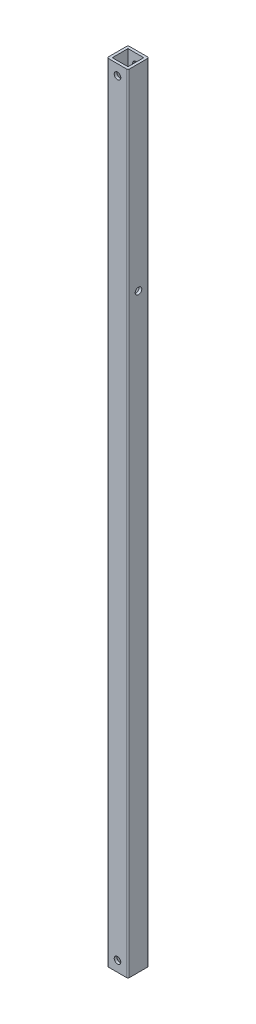
ISO-10303-21;
HEADER;
FILE_DESCRIPTION(('STEP AP214'),'2;1');
FILE_NAME('part.step','',(''),(''),'','','');
FILE_SCHEMA(('AUTOMOTIVE_DESIGN { 1 0 10303 214 1 1 1 1 }'));
ENDSEC;
DATA;
#1=APPLICATION_CONTEXT('core data for automotive mechanical design processes');
#2=APPLICATION_PROTOCOL_DEFINITION('international standard','automotive_design',2000,#1);
#3=PRODUCT_CONTEXT('',#1,'mechanical');
#4=PRODUCT('Part','Part','',(#3));
#5=PRODUCT_RELATED_PRODUCT_CATEGORY('part','',(#4));
#6=PRODUCT_DEFINITION_FORMATION('','',#4);
#7=PRODUCT_DEFINITION_CONTEXT('part definition',#1,'design');
#8=PRODUCT_DEFINITION('design','',#6,#7);
#9=PRODUCT_DEFINITION_SHAPE('','',#8);
#10=(LENGTH_UNIT() NAMED_UNIT(*) SI_UNIT(.MILLI.,.METRE.));
#11=(NAMED_UNIT(*) PLANE_ANGLE_UNIT() SI_UNIT($,.RADIAN.));
#12=(NAMED_UNIT(*) SI_UNIT($,.STERADIAN.) SOLID_ANGLE_UNIT());
#13=UNCERTAINTY_MEASURE_WITH_UNIT(LENGTH_MEASURE(1.E-05),#10,'distance_accuracy_value','');
#14=(GEOMETRIC_REPRESENTATION_CONTEXT(3) GLOBAL_UNCERTAINTY_ASSIGNED_CONTEXT((#13)) GLOBAL_UNIT_ASSIGNED_CONTEXT((#10,
#11,#12)) REPRESENTATION_CONTEXT('',''));
#15=CARTESIAN_POINT('',(0.,0.,0.));
#16=DIRECTION('',(0.,0.,1.));
#17=DIRECTION('',(1.,0.,0.));
#18=AXIS2_PLACEMENT_3D('',#15,#16,#17);
#19=CARTESIAN_POINT('',(0.,600.,0.));
#20=DIRECTION('',(0.,1.,0.));
#21=DIRECTION('',(0.,0.,1.));
#22=AXIS2_PLACEMENT_3D('',#19,#20,#21);
#23=PLANE('',#22);
#24=DIRECTION('',(0.,0.,-1.));
#25=VECTOR('',#24,1.);
#26=CARTESIAN_POINT('',(11.2782874617737,600.,-5.21100917431192));
#27=LINE('',#26,#25);
#28=CARTESIAN_POINT('',(11.2782874617737,600.,9.78899082568807));
#29=VERTEX_POINT('',#28);
#30=CARTESIAN_POINT('',(11.2782874617737,600.,-4.21100917431192));
#31=VERTEX_POINT('',#30);
#32=EDGE_CURVE('E204',#29,#31,#27,.T.);
#33=ORIENTED_EDGE('',*,*,#32,.T.);
#34=CARTESIAN_POINT('',(10.2782874617737,600.,-4.21100917431192));
#35=DIRECTION('',(0.,1.,0.));
#36=DIRECTION('',(0.,0.,1.));
#37=AXIS2_PLACEMENT_3D('',#34,#35,#36);
#38=CIRCLE('',#37,1.);
#39=CARTESIAN_POINT('',(10.2782874617737,600.,-5.21100917431192));
#40=VERTEX_POINT('',#39);
#41=EDGE_CURVE('E259',#31,#40,#38,.T.);
#42=ORIENTED_EDGE('',*,*,#41,.T.);
#43=DIRECTION('',(-1.,0.,0.));
#44=VECTOR('',#43,1.);
#45=CARTESIAN_POINT('',(-4.7217125382263,600.,-5.21100917431192));
#46=LINE('',#45,#44);
#47=CARTESIAN_POINT('',(-3.7217125382263,600.,-5.21100917431192));
#48=VERTEX_POINT('',#47);
#49=EDGE_CURVE('E208',#40,#48,#46,.T.);
#50=ORIENTED_EDGE('',*,*,#49,.T.);
#51=CARTESIAN_POINT('',(-3.7217125382263,600.,-4.21100917431192));
#52=DIRECTION('',(0.,1.,0.));
#53=DIRECTION('',(0.,0.,1.));
#54=AXIS2_PLACEMENT_3D('',#51,#52,#53);
#55=CIRCLE('',#54,1.);
#56=CARTESIAN_POINT('',(-4.7217125382263,600.,-4.21100917431192));
#57=VERTEX_POINT('',#56);
#58=EDGE_CURVE('E256',#48,#57,#55,.T.);
#59=ORIENTED_EDGE('',*,*,#58,.T.);
#60=DIRECTION('',(0.,0.,1.));
#61=VECTOR('',#60,1.);
#62=CARTESIAN_POINT('',(-4.7217125382263,600.,-5.21100917431192));
#63=LINE('',#62,#61);
#64=CARTESIAN_POINT('',(-4.7217125382263,600.,9.78899082568807));
#65=VERTEX_POINT('',#64);
#66=EDGE_CURVE('E197',#57,#65,#63,.T.);
#67=ORIENTED_EDGE('',*,*,#66,.T.);
#68=CARTESIAN_POINT('',(-3.7217125382263,600.,9.78899082568807));
#69=DIRECTION('',(0.,1.,0.));
#70=DIRECTION('',(0.,0.,1.));
#71=AXIS2_PLACEMENT_3D('',#68,#69,#70);
#72=CIRCLE('',#71,1.);
#73=CARTESIAN_POINT('',(-3.7217125382263,600.,10.7889908256881));
#74=VERTEX_POINT('',#73);
#75=EDGE_CURVE('E72',#65,#74,#72,.T.);
#76=ORIENTED_EDGE('',*,*,#75,.T.);
#77=DIRECTION('',(1.,0.,0.));
#78=VECTOR('',#77,1.);
#79=CARTESIAN_POINT('',(-4.7217125382263,600.,10.7889908256881));
#80=LINE('',#79,#78);
#81=CARTESIAN_POINT('',(10.2782874617737,600.,10.7889908256881));
#82=VERTEX_POINT('',#81);
#83=EDGE_CURVE('E200',#74,#82,#80,.T.);
#84=ORIENTED_EDGE('',*,*,#83,.T.);
#85=CARTESIAN_POINT('',(10.2782874617737,600.,9.78899082568807));
#86=DIRECTION('',(0.,1.,0.));
#87=DIRECTION('',(0.,0.,1.));
#88=AXIS2_PLACEMENT_3D('',#85,#86,#87);
#89=CIRCLE('',#88,1.);
#90=EDGE_CURVE('E251',#82,#29,#89,.T.);
#91=ORIENTED_EDGE('',*,*,#90,.T.);
#92=EDGE_LOOP('',(#33,#42,#50,#59,#67,#76,#84,#91));
#93=FACE_BOUND('',#92,.T.);
#94=DIRECTION('',(0.,0.,1.));
#95=VECTOR('',#94,1.);
#96=CARTESIAN_POINT('',(-2.7217125382263,600.,-3.21100917431193));
#97=LINE('',#96,#95);
#98=CARTESIAN_POINT('',(-2.7217125382263,600.,-3.21100917431193));
#99=VERTEX_POINT('',#98);
#100=CARTESIAN_POINT('',(-2.7217125382263,600.,8.78899082568807));
#101=VERTEX_POINT('',#100);
#102=EDGE_CURVE('E153',#99,#101,#97,.T.);
#103=ORIENTED_EDGE('',*,*,#102,.F.);
#104=DIRECTION('',(-1.,0.,0.));
#105=VECTOR('',#104,1.);
#106=CARTESIAN_POINT('',(-2.7217125382263,600.,-3.21100917431193));
#107=LINE('',#106,#105);
#108=CARTESIAN_POINT('',(9.2782874617737,600.,-3.21100917431193));
#109=VERTEX_POINT('',#108);
#110=EDGE_CURVE('E142',#109,#99,#107,.T.);
#111=ORIENTED_EDGE('',*,*,#110,.F.);
#112=DIRECTION('',(0.,0.,-1.));
#113=VECTOR('',#112,1.);
#114=CARTESIAN_POINT('',(9.2782874617737,600.,-3.21100917431193));
#115=LINE('',#114,#113);
#116=CARTESIAN_POINT('',(9.2782874617737,600.,8.78899082568807));
#117=VERTEX_POINT('',#116);
#118=EDGE_CURVE('E171',#117,#109,#115,.T.);
#119=ORIENTED_EDGE('',*,*,#118,.F.);
#120=DIRECTION('',(1.,0.,0.));
#121=VECTOR('',#120,1.);
#122=CARTESIAN_POINT('',(-2.7217125382263,600.,8.78899082568807));
#123=LINE('',#122,#121);
#124=EDGE_CURVE('E167',#101,#117,#123,.T.);
#125=ORIENTED_EDGE('',*,*,#124,.F.);
#126=EDGE_LOOP('',(#103,#111,#119,#125));
#127=FACE_BOUND('',#126,.T.);
#128=ADVANCED_FACE('F48',(#93,#127),#23,.T.);
#129=CARTESIAN_POINT('',(0.,0.,0.));
#130=DIRECTION('',(0.,1.,0.));
#131=DIRECTION('',(0.,0.,1.));
#132=AXIS2_PLACEMENT_3D('',#129,#130,#131);
#133=PLANE('',#132);
#134=DIRECTION('',(-1.,0.,0.));
#135=VECTOR('',#134,1.);
#136=CARTESIAN_POINT('',(-4.7217125382263,0.,-5.21100917431192));
#137=LINE('',#136,#135);
#138=CARTESIAN_POINT('',(10.2782874617737,0.,-5.21100917431192));
#139=VERTEX_POINT('',#138);
#140=CARTESIAN_POINT('',(-3.7217125382263,0.,-5.21100917431192));
#141=VERTEX_POINT('',#140);
#142=EDGE_CURVE('E201',#139,#141,#137,.T.);
#143=ORIENTED_EDGE('',*,*,#142,.F.);
#144=CARTESIAN_POINT('',(10.2782874617737,0.,-4.21100917431192));
#145=DIRECTION('',(0.,1.,0.));
#146=DIRECTION('',(0.,0.,1.));
#147=AXIS2_PLACEMENT_3D('',#144,#145,#146);
#148=CIRCLE('',#147,1.);
#149=CARTESIAN_POINT('',(11.2782874617737,0.,-4.21100917431192));
#150=VERTEX_POINT('',#149);
#151=EDGE_CURVE('E241',#139,#150,#148,.F.);
#152=ORIENTED_EDGE('',*,*,#151,.T.);
#153=DIRECTION('',(0.,0.,-1.));
#154=VECTOR('',#153,1.);
#155=CARTESIAN_POINT('',(11.2782874617737,0.,-5.21100917431192));
#156=LINE('',#155,#154);
#157=CARTESIAN_POINT('',(11.2782874617737,0.,9.78899082568807));
#158=VERTEX_POINT('',#157);
#159=EDGE_CURVE('E219',#158,#150,#156,.T.);
#160=ORIENTED_EDGE('',*,*,#159,.F.);
#161=CARTESIAN_POINT('',(10.2782874617737,0.,9.78899082568807));
#162=DIRECTION('',(0.,1.,0.));
#163=DIRECTION('',(0.,0.,1.));
#164=AXIS2_PLACEMENT_3D('',#161,#162,#163);
#165=CIRCLE('',#164,1.);
#166=CARTESIAN_POINT('',(10.2782874617737,0.,10.7889908256881));
#167=VERTEX_POINT('',#166);
#168=EDGE_CURVE('E232',#158,#167,#165,.F.);
#169=ORIENTED_EDGE('',*,*,#168,.T.);
#170=DIRECTION('',(1.,0.,0.));
#171=VECTOR('',#170,1.);
#172=CARTESIAN_POINT('',(-4.7217125382263,0.,10.7889908256881));
#173=LINE('',#172,#171);
#174=CARTESIAN_POINT('',(-3.7217125382263,0.,10.7889908256881));
#175=VERTEX_POINT('',#174);
#176=EDGE_CURVE('E216',#175,#167,#173,.T.);
#177=ORIENTED_EDGE('',*,*,#176,.F.);
#178=CARTESIAN_POINT('',(-3.7217125382263,0.,9.78899082568807));
#179=DIRECTION('',(0.,1.,0.));
#180=DIRECTION('',(0.,0.,1.));
#181=AXIS2_PLACEMENT_3D('',#178,#179,#180);
#182=CIRCLE('',#181,1.);
#183=CARTESIAN_POINT('',(-4.7217125382263,0.,9.78899082568807));
#184=VERTEX_POINT('',#183);
#185=EDGE_CURVE('E235',#175,#184,#182,.F.);
#186=ORIENTED_EDGE('',*,*,#185,.T.);
#187=DIRECTION('',(0.,0.,1.));
#188=VECTOR('',#187,1.);
#189=CARTESIAN_POINT('',(-4.7217125382263,0.,-5.21100917431192));
#190=LINE('',#189,#188);
#191=CARTESIAN_POINT('',(-4.7217125382263,0.,-4.21100917431192));
#192=VERTEX_POINT('',#191);
#193=EDGE_CURVE('E162',#192,#184,#190,.T.);
#194=ORIENTED_EDGE('',*,*,#193,.F.);
#195=CARTESIAN_POINT('',(-3.7217125382263,0.,-4.21100917431192));
#196=DIRECTION('',(0.,1.,0.));
#197=DIRECTION('',(0.,0.,1.));
#198=AXIS2_PLACEMENT_3D('',#195,#196,#197);
#199=CIRCLE('',#198,1.);
#200=EDGE_CURVE('E238',#192,#141,#199,.F.);
#201=ORIENTED_EDGE('',*,*,#200,.T.);
#202=EDGE_LOOP('',(#143,#152,#160,#169,#177,#186,#194,#201));
#203=FACE_BOUND('',#202,.T.);
#204=DIRECTION('',(-1.,0.,0.));
#205=VECTOR('',#204,1.);
#206=CARTESIAN_POINT('',(-2.7217125382263,0.,-3.21100917431193));
#207=LINE('',#206,#205);
#208=CARTESIAN_POINT('',(9.2782874617737,0.,-3.21100917431193));
#209=VERTEX_POINT('',#208);
#210=CARTESIAN_POINT('',(-2.7217125382263,0.,-3.21100917431193));
#211=VERTEX_POINT('',#210);
#212=EDGE_CURVE('E177',#209,#211,#207,.T.);
#213=ORIENTED_EDGE('',*,*,#212,.T.);
#214=DIRECTION('',(0.,0.,1.));
#215=VECTOR('',#214,1.);
#216=CARTESIAN_POINT('',(-2.7217125382263,0.,-3.21100917431193));
#217=LINE('',#216,#215);
#218=CARTESIAN_POINT('',(-2.7217125382263,0.,8.78899082568807));
#219=VERTEX_POINT('',#218);
#220=EDGE_CURVE('E160',#211,#219,#217,.T.);
#221=ORIENTED_EDGE('',*,*,#220,.T.);
#222=DIRECTION('',(1.,0.,0.));
#223=VECTOR('',#222,1.);
#224=CARTESIAN_POINT('',(-2.7217125382263,0.,8.78899082568807));
#225=LINE('',#224,#223);
#226=CARTESIAN_POINT('',(9.2782874617737,0.,8.78899082568807));
#227=VERTEX_POINT('',#226);
#228=EDGE_CURVE('E183',#219,#227,#225,.T.);
#229=ORIENTED_EDGE('',*,*,#228,.T.);
#230=DIRECTION('',(0.,0.,-1.));
#231=VECTOR('',#230,1.);
#232=CARTESIAN_POINT('',(9.2782874617737,0.,-3.21100917431193));
#233=LINE('',#232,#231);
#234=EDGE_CURVE('E154',#227,#209,#233,.T.);
#235=ORIENTED_EDGE('',*,*,#234,.T.);
#236=EDGE_LOOP('',(#213,#221,#229,#235));
#237=FACE_BOUND('',#236,.T.);
#238=ADVANCED_FACE('F333',(#203,#237),#133,.F.);
#239=CARTESIAN_POINT('',(-4.7217125382263,600.,-5.21100917431192));
#240=DIRECTION('',(1.,0.,0.));
#241=DIRECTION('',(0.,0.,-1.));
#242=AXIS2_PLACEMENT_3D('',#239,#240,#241);
#243=PLANE('',#242);
#244=CARTESIAN_POINT('',(-4.7217125382263,450.,2.78899082568808));
#245=DIRECTION('',(1.,0.,0.));
#246=DIRECTION('',(0.,0.,-1.));
#247=AXIS2_PLACEMENT_3D('',#244,#245,#246);
#248=CIRCLE('',#247,2.5);
#249=CARTESIAN_POINT('',(-4.7217125382263,450.,0.288990825688076));
#250=VERTEX_POINT('',#249);
#251=EDGE_CURVE('E312',#250,#250,#248,.T.);
#252=ORIENTED_EDGE('',*,*,#251,.T.);
#253=EDGE_LOOP('',(#252));
#254=FACE_BOUND('',#253,.T.);
#255=ORIENTED_EDGE('',*,*,#66,.F.);
#256=DIRECTION('',(0.,-1.,0.));
#257=VECTOR('',#256,1.);
#258=CARTESIAN_POINT('',(-4.7217125382263,600.,-4.21100917431192));
#259=LINE('',#258,#257);
#260=EDGE_CURVE('E265',#57,#192,#259,.T.);
#261=ORIENTED_EDGE('',*,*,#260,.T.);
#262=ORIENTED_EDGE('',*,*,#193,.T.);
#263=DIRECTION('',(0.,-1.,0.));
#264=VECTOR('',#263,1.);
#265=CARTESIAN_POINT('',(-4.7217125382263,600.,9.78899082568807));
#266=LINE('',#265,#264);
#267=EDGE_CURVE('E262',#184,#65,#266,.F.);
#268=ORIENTED_EDGE('',*,*,#267,.T.);
#269=EDGE_LOOP('',(#255,#261,#262,#268));
#270=FACE_BOUND('',#269,.T.);
#271=ADVANCED_FACE('F351',(#254,#270),#243,.F.);
#272=CARTESIAN_POINT('',(-4.7217125382263,600.,10.7889908256881));
#273=DIRECTION('',(0.,0.,-1.));
#274=DIRECTION('',(-1.,0.,0.));
#275=AXIS2_PLACEMENT_3D('',#272,#273,#274);
#276=PLANE('',#275);
#277=CARTESIAN_POINT('',(3.2782874617737,592.,10.7889908256881));
#278=DIRECTION('',(0.,0.,1.));
#279=DIRECTION('',(1.,0.,0.));
#280=AXIS2_PLACEMENT_3D('',#277,#278,#279);
#281=CIRCLE('',#280,2.5);
#282=CARTESIAN_POINT('',(5.7782874617737,592.,10.7889908256881));
#283=VERTEX_POINT('',#282);
#284=EDGE_CURVE('E298',#283,#283,#281,.T.);
#285=ORIENTED_EDGE('',*,*,#284,.F.);
#286=EDGE_LOOP('',(#285));
#287=FACE_BOUND('',#286,.T.);
#288=CARTESIAN_POINT('',(3.2782874617737,8.,10.7889908256881));
#289=DIRECTION('',(0.,0.,1.));
#290=DIRECTION('',(1.,0.,0.));
#291=AXIS2_PLACEMENT_3D('',#288,#289,#290);
#292=CIRCLE('',#291,2.5);
#293=CARTESIAN_POINT('',(5.7782874617737,8.,10.7889908256881));
#294=VERTEX_POINT('',#293);
#295=EDGE_CURVE('E293',#294,#294,#292,.T.);
#296=ORIENTED_EDGE('',*,*,#295,.F.);
#297=EDGE_LOOP('',(#296));
#298=FACE_BOUND('',#297,.T.);
#299=ORIENTED_EDGE('',*,*,#83,.F.);
#300=DIRECTION('',(0.,-1.,0.));
#301=VECTOR('',#300,1.);
#302=CARTESIAN_POINT('',(-3.7217125382263,600.,10.7889908256881));
#303=LINE('',#302,#301);
#304=EDGE_CURVE('E11',#74,#175,#303,.T.);
#305=ORIENTED_EDGE('',*,*,#304,.T.);
#306=ORIENTED_EDGE('',*,*,#176,.T.);
#307=DIRECTION('',(0.,-1.,0.));
#308=VECTOR('',#307,1.);
#309=CARTESIAN_POINT('',(10.2782874617737,600.,10.7889908256881));
#310=LINE('',#309,#308);
#311=EDGE_CURVE('E58',#167,#82,#310,.F.);
#312=ORIENTED_EDGE('',*,*,#311,.T.);
#313=EDGE_LOOP('',(#299,#305,#306,#312));
#314=FACE_BOUND('',#313,.T.);
#315=ADVANCED_FACE('F363',(#287,#298,#314),#276,.F.);
#316=CARTESIAN_POINT('',(11.2782874617737,600.,-5.21100917431192));
#317=DIRECTION('',(-1.,0.,0.));
#318=DIRECTION('',(0.,0.,1.));
#319=AXIS2_PLACEMENT_3D('',#316,#317,#318);
#320=PLANE('',#319);
#321=CARTESIAN_POINT('',(11.2782874617737,450.,2.78899082568807));
#322=DIRECTION('',(1.,0.,0.));
#323=DIRECTION('',(0.,0.,-1.));
#324=AXIS2_PLACEMENT_3D('',#321,#322,#323);
#325=CIRCLE('',#324,2.5);
#326=CARTESIAN_POINT('',(11.2782874617737,450.,0.288990825688072));
#327=VERTEX_POINT('',#326);
#328=EDGE_CURVE('E308',#327,#327,#325,.T.);
#329=ORIENTED_EDGE('',*,*,#328,.F.);
#330=EDGE_LOOP('',(#329));
#331=FACE_BOUND('',#330,.T.);
#332=ORIENTED_EDGE('',*,*,#159,.T.);
#333=DIRECTION('',(0.,-1.,0.));
#334=VECTOR('',#333,1.);
#335=CARTESIAN_POINT('',(11.2782874617737,600.,-4.21100917431192));
#336=LINE('',#335,#334);
#337=EDGE_CURVE('E248',#150,#31,#336,.F.);
#338=ORIENTED_EDGE('',*,*,#337,.T.);
#339=ORIENTED_EDGE('',*,*,#32,.F.);
#340=DIRECTION('',(0.,-1.,0.));
#341=VECTOR('',#340,1.);
#342=CARTESIAN_POINT('',(11.2782874617737,600.,9.78899082568807));
#343=LINE('',#342,#341);
#344=EDGE_CURVE('E244',#29,#158,#343,.T.);
#345=ORIENTED_EDGE('',*,*,#344,.T.);
#346=EDGE_LOOP('',(#332,#338,#339,#345));
#347=FACE_BOUND('',#346,.T.);
#348=ADVANCED_FACE('F359',(#331,#347),#320,.F.);
#349=CARTESIAN_POINT('',(-4.7217125382263,600.,-5.21100917431192));
#350=DIRECTION('',(0.,0.,1.));
#351=DIRECTION('',(1.,0.,0.));
#352=AXIS2_PLACEMENT_3D('',#349,#350,#351);
#353=PLANE('',#352);
#354=CARTESIAN_POINT('',(3.2782874617737,592.,-5.21100917431192));
#355=DIRECTION('',(0.,0.,1.));
#356=DIRECTION('',(1.,0.,0.));
#357=AXIS2_PLACEMENT_3D('',#354,#355,#356);
#358=CIRCLE('',#357,2.5);
#359=CARTESIAN_POINT('',(5.7782874617737,592.,-5.21100917431192));
#360=VERTEX_POINT('',#359);
#361=EDGE_CURVE('E275',#360,#360,#358,.T.);
#362=ORIENTED_EDGE('',*,*,#361,.T.);
#363=EDGE_LOOP('',(#362));
#364=FACE_BOUND('',#363,.T.);
#365=CARTESIAN_POINT('',(3.2782874617737,8.,-5.21100917431192));
#366=DIRECTION('',(0.,0.,1.));
#367=DIRECTION('',(1.,0.,0.));
#368=AXIS2_PLACEMENT_3D('',#365,#366,#367);
#369=CIRCLE('',#368,2.5);
#370=CARTESIAN_POINT('',(5.7782874617737,8.,-5.21100917431192));
#371=VERTEX_POINT('',#370);
#372=EDGE_CURVE('E289',#371,#371,#369,.T.);
#373=ORIENTED_EDGE('',*,*,#372,.T.);
#374=EDGE_LOOP('',(#373));
#375=FACE_BOUND('',#374,.T.);
#376=ORIENTED_EDGE('',*,*,#49,.F.);
#377=DIRECTION('',(0.,-1.,0.));
#378=VECTOR('',#377,1.);
#379=CARTESIAN_POINT('',(10.2782874617737,600.,-5.21100917431192));
#380=LINE('',#379,#378);
#381=EDGE_CURVE('E228',#40,#139,#380,.T.);
#382=ORIENTED_EDGE('',*,*,#381,.T.);
#383=ORIENTED_EDGE('',*,*,#142,.T.);
#384=DIRECTION('',(0.,-1.,0.));
#385=VECTOR('',#384,1.);
#386=CARTESIAN_POINT('',(-3.7217125382263,600.,-5.21100917431192));
#387=LINE('',#386,#385);
#388=EDGE_CURVE('E212',#141,#48,#387,.F.);
#389=ORIENTED_EDGE('',*,*,#388,.T.);
#390=EDGE_LOOP('',(#376,#382,#383,#389));
#391=FACE_BOUND('',#390,.T.);
#392=ADVANCED_FACE('F356',(#364,#375,#391),#353,.F.);
#393=CARTESIAN_POINT('',(-2.7217125382263,600.,-3.21100917431193));
#394=DIRECTION('',(0.,0.,1.));
#395=DIRECTION('',(1.,0.,0.));
#396=AXIS2_PLACEMENT_3D('',#393,#394,#395);
#397=PLANE('',#396);
#398=CARTESIAN_POINT('',(3.2782874617737,592.,-3.21100917431193));
#399=DIRECTION('',(0.,0.,1.));
#400=DIRECTION('',(1.,0.,0.));
#401=AXIS2_PLACEMENT_3D('',#398,#399,#400);
#402=CIRCLE('',#401,2.5);
#403=CARTESIAN_POINT('',(5.7782874617737,592.,-3.21100917431193));
#404=VERTEX_POINT('',#403);
#405=EDGE_CURVE('E180',#404,#404,#402,.T.);
#406=ORIENTED_EDGE('',*,*,#405,.F.);
#407=EDGE_LOOP('',(#406));
#408=FACE_BOUND('',#407,.T.);
#409=CARTESIAN_POINT('',(3.2782874617737,8.,-3.21100917431193));
#410=DIRECTION('',(0.,0.,1.));
#411=DIRECTION('',(1.,0.,0.));
#412=AXIS2_PLACEMENT_3D('',#409,#410,#411);
#413=CIRCLE('',#412,2.5);
#414=CARTESIAN_POINT('',(5.7782874617737,8.,-3.21100917431193));
#415=VERTEX_POINT('',#414);
#416=EDGE_CURVE('E274',#415,#415,#413,.T.);
#417=ORIENTED_EDGE('',*,*,#416,.F.);
#418=EDGE_LOOP('',(#417));
#419=FACE_BOUND('',#418,.T.);
#420=ORIENTED_EDGE('',*,*,#212,.F.);
#421=DIRECTION('',(0.,-1.,0.));
#422=VECTOR('',#421,1.);
#423=CARTESIAN_POINT('',(9.2782874617737,600.,-3.21100917431193));
#424=LINE('',#423,#422);
#425=EDGE_CURVE('E148',#109,#209,#424,.T.);
#426=ORIENTED_EDGE('',*,*,#425,.F.);
#427=ORIENTED_EDGE('',*,*,#110,.T.);
#428=DIRECTION('',(0.,-1.,0.));
#429=VECTOR('',#428,1.);
#430=CARTESIAN_POINT('',(-2.7217125382263,600.,-3.21100917431193));
#431=LINE('',#430,#429);
#432=EDGE_CURVE('E145',#99,#211,#431,.T.);
#433=ORIENTED_EDGE('',*,*,#432,.T.);
#434=EDGE_LOOP('',(#420,#426,#427,#433));
#435=FACE_BOUND('',#434,.T.);
#436=ADVANCED_FACE('F144',(#408,#419,#435),#397,.T.);
#437=CARTESIAN_POINT('',(-2.7217125382263,600.,-3.21100917431193));
#438=DIRECTION('',(1.,0.,0.));
#439=DIRECTION('',(0.,0.,-1.));
#440=AXIS2_PLACEMENT_3D('',#437,#438,#439);
#441=PLANE('',#440);
#442=CARTESIAN_POINT('',(-2.7217125382263,450.,2.78899082568808));
#443=DIRECTION('',(1.,0.,0.));
#444=DIRECTION('',(0.,0.,-1.));
#445=AXIS2_PLACEMENT_3D('',#442,#443,#444);
#446=CIRCLE('',#445,2.5);
#447=CARTESIAN_POINT('',(-2.7217125382263,450.,0.288990825688075));
#448=VERTEX_POINT('',#447);
#449=EDGE_CURVE('E294',#448,#448,#446,.T.);
#450=ORIENTED_EDGE('',*,*,#449,.F.);
#451=EDGE_LOOP('',(#450));
#452=FACE_BOUND('',#451,.T.);
#453=ORIENTED_EDGE('',*,*,#220,.F.);
#454=ORIENTED_EDGE('',*,*,#432,.F.);
#455=ORIENTED_EDGE('',*,*,#102,.T.);
#456=DIRECTION('',(0.,-1.,0.));
#457=VECTOR('',#456,1.);
#458=CARTESIAN_POINT('',(-2.7217125382263,600.,8.78899082568807));
#459=LINE('',#458,#457);
#460=EDGE_CURVE('E163',#101,#219,#459,.T.);
#461=ORIENTED_EDGE('',*,*,#460,.T.);
#462=EDGE_LOOP('',(#453,#454,#455,#461));
#463=FACE_BOUND('',#462,.T.);
#464=ADVANCED_FACE('F157',(#452,#463),#441,.T.);
#465=CARTESIAN_POINT('',(-2.7217125382263,600.,8.78899082568807));
#466=DIRECTION('',(0.,0.,-1.));
#467=DIRECTION('',(-1.,0.,0.));
#468=AXIS2_PLACEMENT_3D('',#465,#466,#467);
#469=PLANE('',#468);
#470=CARTESIAN_POINT('',(3.2782874617737,592.,8.78899082568807));
#471=DIRECTION('',(0.,0.,-1.));
#472=DIRECTION('',(-1.,0.,0.));
#473=AXIS2_PLACEMENT_3D('',#470,#471,#472);
#474=CIRCLE('',#473,2.5);
#475=CARTESIAN_POINT('',(0.778287461773701,592.,8.78899082568807));
#476=VERTEX_POINT('',#475);
#477=EDGE_CURVE('E276',#476,#476,#474,.T.);
#478=ORIENTED_EDGE('',*,*,#477,.F.);
#479=EDGE_LOOP('',(#478));
#480=FACE_BOUND('',#479,.T.);
#481=CARTESIAN_POINT('',(3.2782874617737,8.,8.78899082568807));
#482=DIRECTION('',(0.,0.,-1.));
#483=DIRECTION('',(-1.,0.,0.));
#484=AXIS2_PLACEMENT_3D('',#481,#482,#483);
#485=CIRCLE('',#484,2.5);
#486=CARTESIAN_POINT('',(0.778287461773702,8.,8.78899082568807));
#487=VERTEX_POINT('',#486);
#488=EDGE_CURVE('E271',#487,#487,#485,.T.);
#489=ORIENTED_EDGE('',*,*,#488,.F.);
#490=EDGE_LOOP('',(#489));
#491=FACE_BOUND('',#490,.T.);
#492=ORIENTED_EDGE('',*,*,#228,.F.);
#493=ORIENTED_EDGE('',*,*,#460,.F.);
#494=ORIENTED_EDGE('',*,*,#124,.T.);
#495=DIRECTION('',(0.,-1.,0.));
#496=VECTOR('',#495,1.);
#497=CARTESIAN_POINT('',(9.2782874617737,600.,8.78899082568807));
#498=LINE('',#497,#496);
#499=EDGE_CURVE('E192',#117,#227,#498,.T.);
#500=ORIENTED_EDGE('',*,*,#499,.T.);
#501=EDGE_LOOP('',(#492,#493,#494,#500));
#502=FACE_BOUND('',#501,.T.);
#503=ADVANCED_FACE('F328',(#480,#491,#502),#469,.T.);
#504=CARTESIAN_POINT('',(9.2782874617737,600.,-3.21100917431193));
#505=DIRECTION('',(-1.,0.,0.));
#506=DIRECTION('',(0.,0.,1.));
#507=AXIS2_PLACEMENT_3D('',#504,#505,#506);
#508=PLANE('',#507);
#509=CARTESIAN_POINT('',(9.2782874617737,450.,2.78899082568808));
#510=DIRECTION('',(-1.,0.,0.));
#511=DIRECTION('',(0.,0.,1.));
#512=AXIS2_PLACEMENT_3D('',#509,#510,#511);
#513=CIRCLE('',#512,2.5);
#514=CARTESIAN_POINT('',(9.2782874617737,450.,5.28899082568808));
#515=VERTEX_POINT('',#514);
#516=EDGE_CURVE('E52',#515,#515,#513,.T.);
#517=ORIENTED_EDGE('',*,*,#516,.F.);
#518=EDGE_LOOP('',(#517));
#519=FACE_BOUND('',#518,.T.);
#520=ORIENTED_EDGE('',*,*,#234,.F.);
#521=ORIENTED_EDGE('',*,*,#499,.F.);
#522=ORIENTED_EDGE('',*,*,#118,.T.);
#523=ORIENTED_EDGE('',*,*,#425,.T.);
#524=EDGE_LOOP('',(#520,#521,#522,#523));
#525=FACE_BOUND('',#524,.T.);
#526=ADVANCED_FACE('F324',(#519,#525),#508,.T.);
#527=CARTESIAN_POINT('',(10.2782874617737,600.,-4.21100917431192));
#528=DIRECTION('',(0.,-1.,0.));
#529=DIRECTION('',(0.,0.,-1.));
#530=AXIS2_PLACEMENT_3D('',#527,#528,#529);
#531=CYLINDRICAL_SURFACE('',#530,1.);
#532=ORIENTED_EDGE('',*,*,#41,.F.);
#533=ORIENTED_EDGE('',*,*,#337,.F.);
#534=ORIENTED_EDGE('',*,*,#151,.F.);
#535=ORIENTED_EDGE('',*,*,#381,.F.);
#536=EDGE_LOOP('',(#532,#533,#534,#535));
#537=FACE_BOUND('',#536,.T.);
#538=ADVANCED_FACE('F327',(#537),#531,.T.);
#539=CARTESIAN_POINT('',(-3.7217125382263,600.,-4.21100917431192));
#540=DIRECTION('',(0.,-1.,0.));
#541=DIRECTION('',(0.,0.,-1.));
#542=AXIS2_PLACEMENT_3D('',#539,#540,#541);
#543=CYLINDRICAL_SURFACE('',#542,1.);
#544=ORIENTED_EDGE('',*,*,#58,.F.);
#545=ORIENTED_EDGE('',*,*,#388,.F.);
#546=ORIENTED_EDGE('',*,*,#200,.F.);
#547=ORIENTED_EDGE('',*,*,#260,.F.);
#548=EDGE_LOOP('',(#544,#545,#546,#547));
#549=FACE_BOUND('',#548,.T.);
#550=ADVANCED_FACE('F372',(#549),#543,.T.);
#551=CARTESIAN_POINT('',(-3.7217125382263,600.,9.78899082568807));
#552=DIRECTION('',(0.,-1.,0.));
#553=DIRECTION('',(0.,0.,-1.));
#554=AXIS2_PLACEMENT_3D('',#551,#552,#553);
#555=CYLINDRICAL_SURFACE('',#554,1.);
#556=ORIENTED_EDGE('',*,*,#75,.F.);
#557=ORIENTED_EDGE('',*,*,#267,.F.);
#558=ORIENTED_EDGE('',*,*,#185,.F.);
#559=ORIENTED_EDGE('',*,*,#304,.F.);
#560=EDGE_LOOP('',(#556,#557,#558,#559));
#561=FACE_BOUND('',#560,.T.);
#562=ADVANCED_FACE('F375',(#561),#555,.T.);
#563=CARTESIAN_POINT('',(10.2782874617737,600.,9.78899082568807));
#564=DIRECTION('',(0.,-1.,0.));
#565=DIRECTION('',(0.,0.,-1.));
#566=AXIS2_PLACEMENT_3D('',#563,#564,#565);
#567=CYLINDRICAL_SURFACE('',#566,1.);
#568=ORIENTED_EDGE('',*,*,#90,.F.);
#569=ORIENTED_EDGE('',*,*,#311,.F.);
#570=ORIENTED_EDGE('',*,*,#168,.F.);
#571=ORIENTED_EDGE('',*,*,#344,.F.);
#572=EDGE_LOOP('',(#568,#569,#570,#571));
#573=FACE_BOUND('',#572,.T.);
#574=ADVANCED_FACE('F50',(#573),#567,.T.);
#575=CARTESIAN_POINT('',(3.2782874617737,8.,-5.21100917431192));
#576=DIRECTION('',(0.,0.,1.));
#577=DIRECTION('',(1.,0.,0.));
#578=AXIS2_PLACEMENT_3D('',#575,#576,#577);
#579=CYLINDRICAL_SURFACE('',#578,2.5);
#580=ORIENTED_EDGE('',*,*,#488,.T.);
#581=EDGE_LOOP('',(#580));
#582=FACE_BOUND('',#581,.T.);
#583=ORIENTED_EDGE('',*,*,#295,.T.);
#584=EDGE_LOOP('',(#583));
#585=FACE_BOUND('',#584,.T.);
#586=ADVANCED_FACE('F382',(#582,#585),#579,.F.);
#587=CARTESIAN_POINT('',(3.2782874617737,592.,-5.21100917431192));
#588=DIRECTION('',(0.,0.,1.));
#589=DIRECTION('',(1.,0.,0.));
#590=AXIS2_PLACEMENT_3D('',#587,#588,#589);
#591=CYLINDRICAL_SURFACE('',#590,2.5);
#592=ORIENTED_EDGE('',*,*,#477,.T.);
#593=EDGE_LOOP('',(#592));
#594=FACE_BOUND('',#593,.T.);
#595=ORIENTED_EDGE('',*,*,#284,.T.);
#596=EDGE_LOOP('',(#595));
#597=FACE_BOUND('',#596,.T.);
#598=ADVANCED_FACE('F407',(#594,#597),#591,.F.);
#599=ORIENTED_EDGE('',*,*,#416,.T.);
#600=EDGE_LOOP('',(#599));
#601=FACE_BOUND('',#600,.T.);
#602=ORIENTED_EDGE('',*,*,#372,.F.);
#603=EDGE_LOOP('',(#602));
#604=FACE_BOUND('',#603,.T.);
#605=ADVANCED_FACE('F410',(#601,#604),#579,.F.);
#606=ORIENTED_EDGE('',*,*,#405,.T.);
#607=EDGE_LOOP('',(#606));
#608=FACE_BOUND('',#607,.T.);
#609=ORIENTED_EDGE('',*,*,#361,.F.);
#610=EDGE_LOOP('',(#609));
#611=FACE_BOUND('',#610,.T.);
#612=ADVANCED_FACE('F415',(#608,#611),#591,.F.);
#613=CARTESIAN_POINT('',(-4.7217125382263,450.,2.78899082568808));
#614=DIRECTION('',(1.,0.,0.));
#615=DIRECTION('',(0.,0.,-1.));
#616=AXIS2_PLACEMENT_3D('',#613,#614,#615);
#617=CYLINDRICAL_SURFACE('',#616,2.5);
#618=ORIENTED_EDGE('',*,*,#516,.T.);
#619=EDGE_LOOP('',(#618));
#620=FACE_BOUND('',#619,.T.);
#621=ORIENTED_EDGE('',*,*,#328,.T.);
#622=EDGE_LOOP('',(#621));
#623=FACE_BOUND('',#622,.T.);
#624=ADVANCED_FACE('F321',(#620,#623),#617,.F.);
#625=ORIENTED_EDGE('',*,*,#449,.T.);
#626=EDGE_LOOP('',(#625));
#627=FACE_BOUND('',#626,.T.);
#628=ORIENTED_EDGE('',*,*,#251,.F.);
#629=EDGE_LOOP('',(#628));
#630=FACE_BOUND('',#629,.T.);
#631=ADVANCED_FACE('F428',(#627,#630),#617,.F.);
#632=CLOSED_SHELL('',(#128,#238,#271,#315,#348,#392,#436,#464,#503,#526,#538,#550,#562,#574,
#586,#598,#605,#612,#624,#631));
#633=MANIFOLD_SOLID_BREP('B2',#632);
#634=ADVANCED_BREP_SHAPE_REPRESENTATION('',(#18,#633),#14);
#635=SHAPE_DEFINITION_REPRESENTATION(#9,#634);
ENDSEC;
END-ISO-10303-21;
